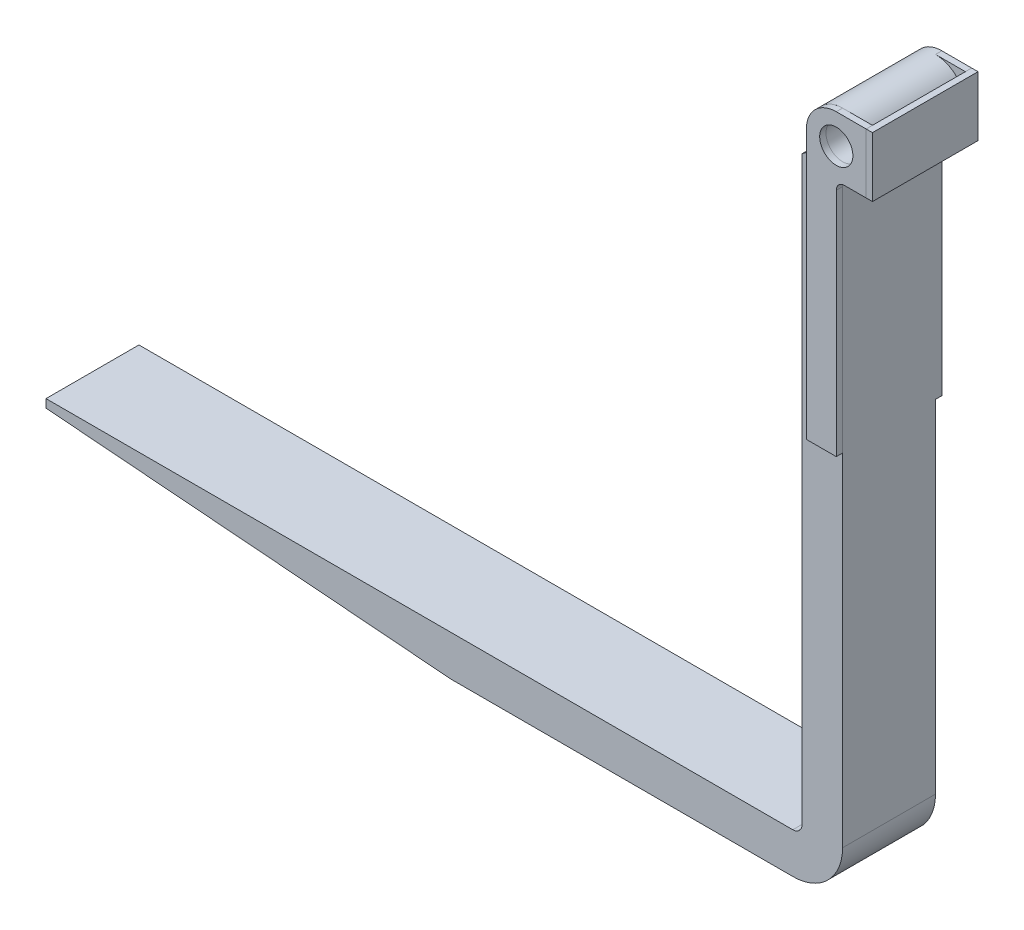
ISO-10303-21;
HEADER;
FILE_DESCRIPTION(('STEP AP214'),'2;1');
FILE_NAME('part.step','',(''),(''),'','','');
FILE_SCHEMA(('AUTOMOTIVE_DESIGN { 1 0 10303 214 1 1 1 1 }'));
ENDSEC;
DATA;
#1=APPLICATION_CONTEXT('core data for automotive mechanical design processes');
#2=APPLICATION_PROTOCOL_DEFINITION('international standard','automotive_design',2000,#1);
#3=PRODUCT_CONTEXT('',#1,'mechanical');
#4=PRODUCT('Part','Part','',(#3));
#5=PRODUCT_RELATED_PRODUCT_CATEGORY('part','',(#4));
#6=PRODUCT_DEFINITION_FORMATION('','',#4);
#7=PRODUCT_DEFINITION_CONTEXT('part definition',#1,'design');
#8=PRODUCT_DEFINITION('design','',#6,#7);
#9=PRODUCT_DEFINITION_SHAPE('','',#8);
#10=(LENGTH_UNIT() NAMED_UNIT(*) SI_UNIT(.MILLI.,.METRE.));
#11=(NAMED_UNIT(*) PLANE_ANGLE_UNIT() SI_UNIT($,.RADIAN.));
#12=(NAMED_UNIT(*) SI_UNIT($,.STERADIAN.) SOLID_ANGLE_UNIT());
#13=UNCERTAINTY_MEASURE_WITH_UNIT(LENGTH_MEASURE(1.E-05),#10,'distance_accuracy_value','');
#14=(GEOMETRIC_REPRESENTATION_CONTEXT(3) GLOBAL_UNCERTAINTY_ASSIGNED_CONTEXT((#13)) GLOBAL_UNIT_ASSIGNED_CONTEXT((#10,
#11,#12)) REPRESENTATION_CONTEXT('',''));
#15=CARTESIAN_POINT('',(0.,0.,0.));
#16=DIRECTION('',(0.,0.,1.));
#17=DIRECTION('',(1.,0.,0.));
#18=AXIS2_PLACEMENT_3D('',#15,#16,#17);
#19=CARTESIAN_POINT('',(54.5,1040.,79.5));
#20=DIRECTION('',(0.,0.,-1.));
#21=DIRECTION('',(-1.,0.,0.));
#22=AXIS2_PLACEMENT_3D('',#19,#20,#21);
#23=PLANE('',#22);
#24=DIRECTION('',(0.,-1.,0.));
#25=VECTOR('',#24,1.);
#26=CARTESIAN_POINT('',(45.,1040.,79.5));
#27=LINE('',#26,#25);
#28=CARTESIAN_POINT('',(45.,1040.,79.5));
#29=VERTEX_POINT('',#28);
#30=CARTESIAN_POINT('',(45.,950.,79.5));
#31=VERTEX_POINT('',#30);
#32=EDGE_CURVE('E114',#29,#31,#27,.T.);
#33=ORIENTED_EDGE('',*,*,#32,.T.);
#34=DIRECTION('',(-1.,0.,0.));
#35=VECTOR('',#34,1.);
#36=CARTESIAN_POINT('',(54.5,950.,79.5));
#37=LINE('',#36,#35);
#38=CARTESIAN_POINT('',(54.5,950.,79.5));
#39=VERTEX_POINT('',#38);
#40=EDGE_CURVE('E12',#39,#31,#37,.T.);
#41=ORIENTED_EDGE('',*,*,#40,.F.);
#42=DIRECTION('',(0.,-1.,0.));
#43=VECTOR('',#42,1.);
#44=CARTESIAN_POINT('',(54.5,1040.,79.5));
#45=LINE('',#44,#43);
#46=CARTESIAN_POINT('',(54.5,1040.,79.5));
#47=VERTEX_POINT('',#46);
#48=EDGE_CURVE('E102',#47,#39,#45,.T.);
#49=ORIENTED_EDGE('',*,*,#48,.F.);
#50=DIRECTION('',(-1.,0.,0.));
#51=VECTOR('',#50,1.);
#52=CARTESIAN_POINT('',(54.5,1040.,79.5));
#53=LINE('',#52,#51);
#54=EDGE_CURVE('E110',#47,#29,#53,.T.);
#55=ORIENTED_EDGE('',*,*,#54,.T.);
#56=EDGE_LOOP('',(#33,#41,#49,#55));
#57=FACE_BOUND('',#56,.T.);
#58=ADVANCED_FACE('F51',(#57),#23,.F.);
#59=CARTESIAN_POINT('',(54.5,950.,79.5));
#60=DIRECTION('',(0.,1.,0.));
#61=DIRECTION('',(-1.,0.,0.));
#62=AXIS2_PLACEMENT_3D('',#59,#60,#61);
#63=PLANE('',#62);
#64=DIRECTION('',(0.,0.,-1.));
#65=VECTOR('',#64,1.);
#66=CARTESIAN_POINT('',(45.,950.,79.5));
#67=LINE('',#66,#65);
#68=CARTESIAN_POINT('',(45.,950.,-79.5));
#69=VERTEX_POINT('',#68);
#70=EDGE_CURVE('E106',#31,#69,#67,.T.);
#71=ORIENTED_EDGE('',*,*,#70,.T.);
#72=DIRECTION('',(-1.,0.,0.));
#73=VECTOR('',#72,1.);
#74=CARTESIAN_POINT('',(54.5,950.,-79.5));
#75=LINE('',#74,#73);
#76=CARTESIAN_POINT('',(54.5,950.,-79.5));
#77=VERTEX_POINT('',#76);
#78=EDGE_CURVE('E59',#77,#69,#75,.T.);
#79=ORIENTED_EDGE('',*,*,#78,.F.);
#80=DIRECTION('',(0.,0.,-1.));
#81=VECTOR('',#80,1.);
#82=CARTESIAN_POINT('',(54.5,950.,79.5));
#83=LINE('',#82,#81);
#84=EDGE_CURVE('E97',#39,#77,#83,.T.);
#85=ORIENTED_EDGE('',*,*,#84,.F.);
#86=ORIENTED_EDGE('',*,*,#40,.T.);
#87=EDGE_LOOP('',(#71,#79,#85,#86));
#88=FACE_BOUND('',#87,.T.);
#89=ADVANCED_FACE('F105',(#88),#63,.F.);
#90=CARTESIAN_POINT('',(54.5,1040.,-79.5));
#91=DIRECTION('',(0.,0.,1.));
#92=DIRECTION('',(1.,0.,0.));
#93=AXIS2_PLACEMENT_3D('',#90,#91,#92);
#94=PLANE('',#93);
#95=DIRECTION('',(0.,1.,0.));
#96=VECTOR('',#95,1.);
#97=CARTESIAN_POINT('',(45.,1040.,-79.5));
#98=LINE('',#97,#96);
#99=CARTESIAN_POINT('',(45.,1040.,-79.5));
#100=VERTEX_POINT('',#99);
#101=EDGE_CURVE('E84',#69,#100,#98,.T.);
#102=ORIENTED_EDGE('',*,*,#101,.T.);
#103=DIRECTION('',(-1.,0.,0.));
#104=VECTOR('',#103,1.);
#105=CARTESIAN_POINT('',(54.5,1040.,-79.5));
#106=LINE('',#105,#104);
#107=CARTESIAN_POINT('',(54.5,1040.,-79.5));
#108=VERTEX_POINT('',#107);
#109=EDGE_CURVE('E107',#108,#100,#106,.T.);
#110=ORIENTED_EDGE('',*,*,#109,.F.);
#111=DIRECTION('',(0.,1.,0.));
#112=VECTOR('',#111,1.);
#113=CARTESIAN_POINT('',(54.5,1040.,-79.5));
#114=LINE('',#113,#112);
#115=EDGE_CURVE('E100',#77,#108,#114,.T.);
#116=ORIENTED_EDGE('',*,*,#115,.F.);
#117=ORIENTED_EDGE('',*,*,#78,.T.);
#118=EDGE_LOOP('',(#102,#110,#116,#117));
#119=FACE_BOUND('',#118,.T.);
#120=ADVANCED_FACE('F108',(#119),#94,.F.);
#121=CARTESIAN_POINT('',(54.5,1040.,79.5));
#122=DIRECTION('',(0.,-1.,0.));
#123=DIRECTION('',(1.,0.,0.));
#124=AXIS2_PLACEMENT_3D('',#121,#122,#123);
#125=PLANE('',#124);
#126=DIRECTION('',(0.,0.,1.));
#127=VECTOR('',#126,1.);
#128=CARTESIAN_POINT('',(45.,1040.,79.5));
#129=LINE('',#128,#127);
#130=EDGE_CURVE('E90',#100,#29,#129,.T.);
#131=ORIENTED_EDGE('',*,*,#130,.T.);
#132=ORIENTED_EDGE('',*,*,#54,.F.);
#133=DIRECTION('',(0.,0.,1.));
#134=VECTOR('',#133,1.);
#135=CARTESIAN_POINT('',(54.5,1040.,79.5));
#136=LINE('',#135,#134);
#137=EDGE_CURVE('E67',#108,#47,#136,.T.);
#138=ORIENTED_EDGE('',*,*,#137,.F.);
#139=ORIENTED_EDGE('',*,*,#109,.T.);
#140=EDGE_LOOP('',(#131,#132,#138,#139));
#141=FACE_BOUND('',#140,.T.);
#142=ADVANCED_FACE('F121',(#141),#125,.F.);
#143=CARTESIAN_POINT('',(54.5000000000002,0.,0.));
#144=DIRECTION('',(1.,0.,0.));
#145=DIRECTION('',(0.,1.,0.));
#146=AXIS2_PLACEMENT_3D('',#143,#144,#145);
#147=PLANE('',#146);
#148=ORIENTED_EDGE('',*,*,#48,.T.);
#149=ORIENTED_EDGE('',*,*,#84,.T.);
#150=ORIENTED_EDGE('',*,*,#115,.T.);
#151=ORIENTED_EDGE('',*,*,#137,.T.);
#152=EDGE_LOOP('',(#148,#149,#150,#151));
#153=FACE_BOUND('',#152,.T.);
#154=ADVANCED_FACE('F98',(#153),#147,.T.);
#155=CARTESIAN_POINT('',(45.0000000000002,0.,0.));
#156=DIRECTION('',(1.,0.,0.));
#157=DIRECTION('',(0.,1.,0.));
#158=AXIS2_PLACEMENT_3D('',#155,#156,#157);
#159=PLANE('',#158);
#160=ORIENTED_EDGE('',*,*,#32,.F.);
#161=ORIENTED_EDGE('',*,*,#130,.F.);
#162=ORIENTED_EDGE('',*,*,#101,.F.);
#163=ORIENTED_EDGE('',*,*,#70,.F.);
#164=EDGE_LOOP('',(#160,#161,#162,#163));
#165=FACE_BOUND('',#164,.T.);
#166=ADVANCED_FACE('F124',(#165),#159,.F.);
#167=CLOSED_SHELL('',(#58,#89,#120,#142,#154,#166));
#168=MANIFOLD_SOLID_BREP('B2',#167);
#169=CARTESIAN_POINT('',(0.,995.,79.5));
#170=DIRECTION('',(0.,0.,-1.));
#171=DIRECTION('',(-1.,0.,0.));
#172=AXIS2_PLACEMENT_3D('',#169,#170,#171);
#173=CYLINDRICAL_SURFACE('',#172,45.);
#174=CARTESIAN_POINT('',(0.,995.,70.));
#175=DIRECTION('',(0.,0.,1.));
#176=DIRECTION('',(1.,0.,0.));
#177=AXIS2_PLACEMENT_3D('',#174,#175,#176);
#178=CIRCLE('',#177,45.);
#179=CARTESIAN_POINT('',(0.,1040.,70.));
#180=VERTEX_POINT('',#179);
#181=CARTESIAN_POINT('',(-45.,995.,70.));
#182=VERTEX_POINT('',#181);
#183=EDGE_CURVE('E285',#180,#182,#178,.T.);
#184=ORIENTED_EDGE('',*,*,#183,.T.);
#185=DIRECTION('',(0.,0.,-1.));
#186=VECTOR('',#185,1.);
#187=CARTESIAN_POINT('',(-45.,995.,79.5));
#188=LINE('',#187,#186);
#189=CARTESIAN_POINT('',(-45.,995.,79.5));
#190=VERTEX_POINT('',#189);
#191=EDGE_CURVE('E49',#190,#182,#188,.T.);
#192=ORIENTED_EDGE('',*,*,#191,.F.);
#193=CARTESIAN_POINT('',(0.,995.,79.5));
#194=DIRECTION('',(0.,0.,1.));
#195=DIRECTION('',(1.,0.,0.));
#196=AXIS2_PLACEMENT_3D('',#193,#194,#195);
#197=CIRCLE('',#196,45.);
#198=CARTESIAN_POINT('',(0.,1040.,79.5));
#199=VERTEX_POINT('',#198);
#200=EDGE_CURVE('E330',#199,#190,#197,.T.);
#201=ORIENTED_EDGE('',*,*,#200,.F.);
#202=DIRECTION('',(0.,0.,-1.));
#203=VECTOR('',#202,1.);
#204=CARTESIAN_POINT('',(0.,1040.,79.5));
#205=LINE('',#204,#203);
#206=EDGE_CURVE('E201',#199,#180,#205,.T.);
#207=ORIENTED_EDGE('',*,*,#206,.T.);
#208=EDGE_LOOP('',(#184,#192,#201,#207));
#209=FACE_BOUND('',#208,.T.);
#210=ADVANCED_FACE('F184',(#209),#173,.T.);
#211=CARTESIAN_POINT('',(-45.000000000002,0.,79.5));
#212=DIRECTION('',(1.,0.,0.));
#213=DIRECTION('',(0.,1.,0.));
#214=AXIS2_PLACEMENT_3D('',#211,#212,#213);
#215=PLANE('',#214);
#216=DIRECTION('',(0.,-1.,0.));
#217=VECTOR('',#216,1.);
#218=CARTESIAN_POINT('',(-45.000000000002,0.,70.));
#219=LINE('',#218,#217);
#220=CARTESIAN_POINT('',(-45.0000000000008,590.,70.));
#221=VERTEX_POINT('',#220);
#222=EDGE_CURVE('E287',#182,#221,#219,.T.);
#223=ORIENTED_EDGE('',*,*,#222,.T.);
#224=DIRECTION('',(0.,0.,-1.));
#225=VECTOR('',#224,1.);
#226=CARTESIAN_POINT('',(-45.0000000000008,590.,79.5));
#227=LINE('',#226,#225);
#228=CARTESIAN_POINT('',(-45.0000000000008,590.,79.5));
#229=VERTEX_POINT('',#228);
#230=EDGE_CURVE('E193',#229,#221,#227,.T.);
#231=ORIENTED_EDGE('',*,*,#230,.F.);
#232=DIRECTION('',(0.,-1.,0.));
#233=VECTOR('',#232,1.);
#234=CARTESIAN_POINT('',(-45.000000000002,0.,79.5));
#235=LINE('',#234,#233);
#236=EDGE_CURVE('E239',#190,#229,#235,.T.);
#237=ORIENTED_EDGE('',*,*,#236,.F.);
#238=ORIENTED_EDGE('',*,*,#191,.T.);
#239=EDGE_LOOP('',(#223,#231,#237,#238));
#240=FACE_BOUND('',#239,.T.);
#241=ADVANCED_FACE('F318',(#240),#215,.F.);
#242=CARTESIAN_POINT('',(-1.45562574339743E-12,590.,79.5));
#243=DIRECTION('',(0.,-1.,0.));
#244=DIRECTION('',(1.,0.,0.));
#245=AXIS2_PLACEMENT_3D('',#242,#243,#244);
#246=PLANE('',#245);
#247=DIRECTION('',(-1.,0.,0.));
#248=VECTOR('',#247,1.);
#249=CARTESIAN_POINT('',(-1.45562574339743E-12,590.,70.));
#250=LINE('',#249,#248);
#251=CARTESIAN_POINT('',(1.67586767851234E-12,590.,70.));
#252=VERTEX_POINT('',#251);
#253=EDGE_CURVE('E290',#252,#221,#250,.T.);
#254=ORIENTED_EDGE('',*,*,#253,.F.);
#255=DIRECTION('',(0.,0.,-1.));
#256=VECTOR('',#255,1.);
#257=CARTESIAN_POINT('',(1.67586767851234E-12,590.,79.5));
#258=LINE('',#257,#256);
#259=CARTESIAN_POINT('',(1.67586767851234E-12,590.,79.5));
#260=VERTEX_POINT('',#259);
#261=EDGE_CURVE('E311',#260,#252,#258,.T.);
#262=ORIENTED_EDGE('',*,*,#261,.F.);
#263=DIRECTION('',(-1.,0.,0.));
#264=VECTOR('',#263,1.);
#265=CARTESIAN_POINT('',(-1.45562574339743E-12,590.,79.5));
#266=LINE('',#265,#264);
#267=EDGE_CURVE('E317',#260,#229,#266,.T.);
#268=ORIENTED_EDGE('',*,*,#267,.T.);
#269=ORIENTED_EDGE('',*,*,#230,.T.);
#270=EDGE_LOOP('',(#254,#262,#268,#269));
#271=FACE_BOUND('',#270,.T.);
#272=ADVANCED_FACE('F315',(#271),#246,.T.);
#273=CARTESIAN_POINT('',(0.,0.,79.5));
#274=DIRECTION('',(1.,0.,0.));
#275=DIRECTION('',(0.,1.,0.));
#276=AXIS2_PLACEMENT_3D('',#273,#274,#275);
#277=PLANE('',#276);
#278=DIRECTION('',(0.,-1.,0.));
#279=VECTOR('',#278,1.);
#280=CARTESIAN_POINT('',(0.,0.,70.));
#281=LINE('',#280,#279);
#282=CARTESIAN_POINT('',(2.66292533661918E-12,937.5,70.));
#283=VERTEX_POINT('',#282);
#284=EDGE_CURVE('E293',#283,#252,#281,.T.);
#285=ORIENTED_EDGE('',*,*,#284,.F.);
#286=DIRECTION('',(0.,0.,-1.));
#287=VECTOR('',#286,1.);
#288=CARTESIAN_POINT('',(2.66292533661918E-12,937.5,79.5));
#289=LINE('',#288,#287);
#290=CARTESIAN_POINT('',(2.66292533661918E-12,937.5,79.5));
#291=VERTEX_POINT('',#290);
#292=EDGE_CURVE('E309',#291,#283,#289,.T.);
#293=ORIENTED_EDGE('',*,*,#292,.F.);
#294=DIRECTION('',(0.,-1.,0.));
#295=VECTOR('',#294,1.);
#296=CARTESIAN_POINT('',(0.,0.,79.5));
#297=LINE('',#296,#295);
#298=EDGE_CURVE('E327',#291,#260,#297,.T.);
#299=ORIENTED_EDGE('',*,*,#298,.T.);
#300=ORIENTED_EDGE('',*,*,#261,.T.);
#301=EDGE_LOOP('',(#285,#293,#299,#300));
#302=FACE_BOUND('',#301,.T.);
#303=ADVANCED_FACE('F325',(#302),#277,.T.);
#304=CARTESIAN_POINT('',(12.5,937.5,79.5));
#305=DIRECTION('',(0.,0.,-1.));
#306=DIRECTION('',(-1.,0.,0.));
#307=AXIS2_PLACEMENT_3D('',#304,#305,#306);
#308=CYLINDRICAL_SURFACE('',#307,12.5);
#309=CARTESIAN_POINT('',(12.5,937.5,70.));
#310=DIRECTION('',(0.,0.,1.));
#311=DIRECTION('',(1.,0.,0.));
#312=AXIS2_PLACEMENT_3D('',#309,#310,#311);
#313=CIRCLE('',#312,12.5);
#314=CARTESIAN_POINT('',(12.5000000000001,950.,70.));
#315=VERTEX_POINT('',#314);
#316=EDGE_CURVE('E296',#315,#283,#313,.T.);
#317=ORIENTED_EDGE('',*,*,#316,.F.);
#318=DIRECTION('',(0.,0.,-1.));
#319=VECTOR('',#318,1.);
#320=CARTESIAN_POINT('',(12.5000000000001,950.,79.5));
#321=LINE('',#320,#319);
#322=CARTESIAN_POINT('',(12.5000000000001,950.,79.5));
#323=VERTEX_POINT('',#322);
#324=EDGE_CURVE('E264',#323,#315,#321,.T.);
#325=ORIENTED_EDGE('',*,*,#324,.F.);
#326=CARTESIAN_POINT('',(12.5,937.5,79.5));
#327=DIRECTION('',(0.,0.,1.));
#328=DIRECTION('',(1.,0.,0.));
#329=AXIS2_PLACEMENT_3D('',#326,#327,#328);
#330=CIRCLE('',#329,12.5);
#331=EDGE_CURVE('E274',#323,#291,#330,.T.);
#332=ORIENTED_EDGE('',*,*,#331,.T.);
#333=ORIENTED_EDGE('',*,*,#292,.T.);
#334=EDGE_LOOP('',(#317,#325,#332,#333));
#335=FACE_BOUND('',#334,.T.);
#336=ADVANCED_FACE('F334',(#335),#308,.F.);
#337=CARTESIAN_POINT('',(0.,950.,79.5));
#338=DIRECTION('',(0.,-1.,0.));
#339=DIRECTION('',(0.,0.,-1.));
#340=AXIS2_PLACEMENT_3D('',#337,#338,#339);
#341=PLANE('',#340);
#342=DIRECTION('',(-1.,0.,0.));
#343=VECTOR('',#342,1.);
#344=CARTESIAN_POINT('',(0.,950.,70.));
#345=LINE('',#344,#343);
#346=CARTESIAN_POINT('',(45.,950.,70.));
#347=VERTEX_POINT('',#346);
#348=EDGE_CURVE('E260',#347,#315,#345,.T.);
#349=ORIENTED_EDGE('',*,*,#348,.F.);
#350=DIRECTION('',(0.,0.,-1.));
#351=VECTOR('',#350,1.);
#352=CARTESIAN_POINT('',(45.,950.,79.5));
#353=LINE('',#352,#351);
#354=CARTESIAN_POINT('',(45.,950.,79.5));
#355=VERTEX_POINT('',#354);
#356=EDGE_CURVE('E255',#355,#347,#353,.T.);
#357=ORIENTED_EDGE('',*,*,#356,.F.);
#358=DIRECTION('',(-1.,0.,0.));
#359=VECTOR('',#358,1.);
#360=CARTESIAN_POINT('',(0.,950.,79.5));
#361=LINE('',#360,#359);
#362=EDGE_CURVE('E258',#355,#323,#361,.T.);
#363=ORIENTED_EDGE('',*,*,#362,.T.);
#364=ORIENTED_EDGE('',*,*,#324,.T.);
#365=EDGE_LOOP('',(#349,#357,#363,#364));
#366=FACE_BOUND('',#365,.T.);
#367=ADVANCED_FACE('F257',(#366),#341,.T.);
#368=CARTESIAN_POINT('',(45.0000000000002,0.,79.5));
#369=DIRECTION('',(1.,0.,0.));
#370=DIRECTION('',(0.,1.,0.));
#371=AXIS2_PLACEMENT_3D('',#368,#369,#370);
#372=PLANE('',#371);
#373=DIRECTION('',(0.,-1.,0.));
#374=VECTOR('',#373,1.);
#375=CARTESIAN_POINT('',(45.0000000000002,0.,70.));
#376=LINE('',#375,#374);
#377=CARTESIAN_POINT('',(45.,1040.,70.));
#378=VERTEX_POINT('',#377);
#379=EDGE_CURVE('E300',#378,#347,#376,.T.);
#380=ORIENTED_EDGE('',*,*,#379,.F.);
#381=DIRECTION('',(0.,0.,-1.));
#382=VECTOR('',#381,1.);
#383=CARTESIAN_POINT('',(45.,1040.,79.5));
#384=LINE('',#383,#382);
#385=CARTESIAN_POINT('',(45.,1040.,79.5));
#386=VERTEX_POINT('',#385);
#387=EDGE_CURVE('E227',#386,#378,#384,.T.);
#388=ORIENTED_EDGE('',*,*,#387,.F.);
#389=DIRECTION('',(0.,-1.,0.));
#390=VECTOR('',#389,1.);
#391=CARTESIAN_POINT('',(45.0000000000002,0.,79.5));
#392=LINE('',#391,#390);
#393=EDGE_CURVE('E271',#386,#355,#392,.T.);
#394=ORIENTED_EDGE('',*,*,#393,.T.);
#395=ORIENTED_EDGE('',*,*,#356,.T.);
#396=EDGE_LOOP('',(#380,#388,#394,#395));
#397=FACE_BOUND('',#396,.T.);
#398=ADVANCED_FACE('F276',(#397),#372,.T.);
#399=CARTESIAN_POINT('',(0.,995.,79.5));
#400=DIRECTION('',(0.,0.,-1.));
#401=DIRECTION('',(-1.,0.,0.));
#402=AXIS2_PLACEMENT_3D('',#399,#400,#401);
#403=CYLINDRICAL_SURFACE('',#402,25.);
#404=CARTESIAN_POINT('',(0.,995.,79.5));
#405=DIRECTION('',(0.,0.,1.));
#406=DIRECTION('',(1.,0.,0.));
#407=AXIS2_PLACEMENT_3D('',#404,#405,#406);
#408=CIRCLE('',#407,25.);
#409=CARTESIAN_POINT('',(25.,995.,79.5));
#410=VERTEX_POINT('',#409);
#411=EDGE_CURVE('E305',#410,#410,#408,.F.);
#412=ORIENTED_EDGE('',*,*,#411,.F.);
#413=EDGE_LOOP('',(#412));
#414=FACE_BOUND('',#413,.T.);
#415=CARTESIAN_POINT('',(0.,995.,70.));
#416=DIRECTION('',(0.,0.,1.));
#417=DIRECTION('',(1.,0.,0.));
#418=AXIS2_PLACEMENT_3D('',#415,#416,#417);
#419=CIRCLE('',#418,25.);
#420=CARTESIAN_POINT('',(25.,995.,70.));
#421=VERTEX_POINT('',#420);
#422=EDGE_CURVE('E282',#421,#421,#419,.F.);
#423=ORIENTED_EDGE('',*,*,#422,.T.);
#424=EDGE_LOOP('',(#423));
#425=FACE_BOUND('',#424,.T.);
#426=ADVANCED_FACE('F186',(#414,#425),#403,.F.);
#427=CARTESIAN_POINT('',(0.,1040.,79.5));
#428=DIRECTION('',(0.,1.,0.));
#429=DIRECTION('',(0.,0.,1.));
#430=AXIS2_PLACEMENT_3D('',#427,#428,#429);
#431=PLANE('',#430);
#432=DIRECTION('',(1.,0.,0.));
#433=VECTOR('',#432,1.);
#434=CARTESIAN_POINT('',(0.,1040.,70.));
#435=LINE('',#434,#433);
#436=EDGE_CURVE('E302',#180,#378,#435,.T.);
#437=ORIENTED_EDGE('',*,*,#436,.F.);
#438=ORIENTED_EDGE('',*,*,#206,.F.);
#439=DIRECTION('',(1.,0.,0.));
#440=VECTOR('',#439,1.);
#441=CARTESIAN_POINT('',(0.,1040.,79.5));
#442=LINE('',#441,#440);
#443=EDGE_CURVE('E277',#199,#386,#442,.T.);
#444=ORIENTED_EDGE('',*,*,#443,.T.);
#445=ORIENTED_EDGE('',*,*,#387,.T.);
#446=EDGE_LOOP('',(#437,#438,#444,#445));
#447=FACE_BOUND('',#446,.T.);
#448=ADVANCED_FACE('F335',(#447),#431,.T.);
#449=CARTESIAN_POINT('',(0.,0.,79.5));
#450=DIRECTION('',(0.,0.,1.));
#451=DIRECTION('',(1.,0.,0.));
#452=AXIS2_PLACEMENT_3D('',#449,#450,#451);
#453=PLANE('',#452);
#454=ORIENTED_EDGE('',*,*,#411,.T.);
#455=EDGE_LOOP('',(#454));
#456=FACE_BOUND('',#455,.T.);
#457=ORIENTED_EDGE('',*,*,#200,.T.);
#458=ORIENTED_EDGE('',*,*,#236,.T.);
#459=ORIENTED_EDGE('',*,*,#267,.F.);
#460=ORIENTED_EDGE('',*,*,#298,.F.);
#461=ORIENTED_EDGE('',*,*,#331,.F.);
#462=ORIENTED_EDGE('',*,*,#362,.F.);
#463=ORIENTED_EDGE('',*,*,#393,.F.);
#464=ORIENTED_EDGE('',*,*,#443,.F.);
#465=EDGE_LOOP('',(#457,#458,#459,#460,#461,#462,#463,#464));
#466=FACE_BOUND('',#465,.T.);
#467=ADVANCED_FACE('F269',(#456,#466),#453,.T.);
#468=CARTESIAN_POINT('',(0.,0.,70.));
#469=DIRECTION('',(0.,0.,1.));
#470=DIRECTION('',(1.,0.,0.));
#471=AXIS2_PLACEMENT_3D('',#468,#469,#470);
#472=PLANE('',#471);
#473=ORIENTED_EDGE('',*,*,#422,.F.);
#474=EDGE_LOOP('',(#473));
#475=FACE_BOUND('',#474,.T.);
#476=ORIENTED_EDGE('',*,*,#183,.F.);
#477=ORIENTED_EDGE('',*,*,#436,.T.);
#478=ORIENTED_EDGE('',*,*,#379,.T.);
#479=ORIENTED_EDGE('',*,*,#348,.T.);
#480=ORIENTED_EDGE('',*,*,#316,.T.);
#481=ORIENTED_EDGE('',*,*,#284,.T.);
#482=ORIENTED_EDGE('',*,*,#253,.T.);
#483=ORIENTED_EDGE('',*,*,#222,.F.);
#484=EDGE_LOOP('',(#476,#477,#478,#479,#480,#481,#482,#483));
#485=FACE_BOUND('',#484,.T.);
#486=ADVANCED_FACE('F321',(#475,#485),#472,.F.);
#487=CLOSED_SHELL('',(#210,#241,#272,#303,#336,#367,#398,#426,#448,#467,#486));
#488=MANIFOLD_SOLID_BREP('B6',#487);
#489=CARTESIAN_POINT('',(0.,0.,-70.));
#490=DIRECTION('',(0.,0.,-1.));
#491=DIRECTION('',(1.,0.,0.));
#492=AXIS2_PLACEMENT_3D('',#489,#490,#491);
#493=PLANE('',#492);
#494=CARTESIAN_POINT('',(0.,995.,-70.));
#495=DIRECTION('',(0.,0.,-1.));
#496=DIRECTION('',(-1.,0.,0.));
#497=AXIS2_PLACEMENT_3D('',#494,#495,#496);
#498=CIRCLE('',#497,45.);
#499=CARTESIAN_POINT('',(0.,950.,-70.));
#500=VERTEX_POINT('',#499);
#501=CARTESIAN_POINT('',(45.,995.,-70.));
#502=VERTEX_POINT('',#501);
#503=EDGE_CURVE('E597',#500,#502,#498,.F.);
#504=ORIENTED_EDGE('',*,*,#503,.F.);
#505=DIRECTION('',(0.,-1.,0.));
#506=VECTOR('',#505,1.);
#507=CARTESIAN_POINT('',(0.,75.0000000000005,-70.));
#508=LINE('',#507,#506);
#509=CARTESIAN_POINT('',(0.,937.5,-70.));
#510=VERTEX_POINT('',#509);
#511=EDGE_CURVE('E711',#500,#510,#508,.T.);
#512=ORIENTED_EDGE('',*,*,#511,.T.);
#513=CARTESIAN_POINT('',(12.5,937.5,-70.));
#514=DIRECTION('',(0.,0.,1.));
#515=DIRECTION('',(1.,0.,0.));
#516=AXIS2_PLACEMENT_3D('',#513,#514,#515);
#517=CIRCLE('',#516,12.5);
#518=CARTESIAN_POINT('',(12.5000000000001,950.,-70.));
#519=VERTEX_POINT('',#518);
#520=EDGE_CURVE('E643',#519,#510,#517,.T.);
#521=ORIENTED_EDGE('',*,*,#520,.F.);
#522=DIRECTION('',(-1.,0.,0.));
#523=VECTOR('',#522,1.);
#524=CARTESIAN_POINT('',(0.,950.,-70.));
#525=LINE('',#524,#523);
#526=CARTESIAN_POINT('',(45.,950.,-70.));
#527=VERTEX_POINT('',#526);
#528=EDGE_CURVE('E651',#527,#519,#525,.T.);
#529=ORIENTED_EDGE('',*,*,#528,.F.);
#530=DIRECTION('',(0.,-1.,0.));
#531=VECTOR('',#530,1.);
#532=CARTESIAN_POINT('',(45.0000000000002,0.,-70.));
#533=LINE('',#532,#531);
#534=EDGE_CURVE('E658',#502,#527,#533,.T.);
#535=ORIENTED_EDGE('',*,*,#534,.F.);
#536=EDGE_LOOP('',(#504,#512,#521,#529,#535));
#537=FACE_BOUND('',#536,.T.);
#538=ADVANCED_FACE('F447',(#537),#493,.F.);
#539=CARTESIAN_POINT('',(0.,995.,-70.));
#540=DIRECTION('',(0.,0.,1.));
#541=DIRECTION('',(1.,0.,0.));
#542=AXIS2_PLACEMENT_3D('',#539,#540,#541);
#543=CIRCLE('',#542,45.);
#544=CARTESIAN_POINT('',(0.,1040.,-70.));
#545=VERTEX_POINT('',#544);
#546=EDGE_CURVE('E606',#502,#545,#543,.T.);
#547=ORIENTED_EDGE('',*,*,#546,.F.);
#548=CARTESIAN_POINT('',(45.,1040.,-70.));
#549=VERTEX_POINT('',#548);
#550=EDGE_CURVE('E659',#549,#502,#533,.T.);
#551=ORIENTED_EDGE('',*,*,#550,.F.);
#552=DIRECTION('',(1.,0.,0.));
#553=VECTOR('',#552,1.);
#554=CARTESIAN_POINT('',(0.,1040.,-70.));
#555=LINE('',#554,#553);
#556=EDGE_CURVE('E670',#545,#549,#555,.T.);
#557=ORIENTED_EDGE('',*,*,#556,.F.);
#558=EDGE_LOOP('',(#547,#551,#557));
#559=FACE_BOUND('',#558,.T.);
#560=ADVANCED_FACE('F767',(#559),#493,.F.);
#561=CARTESIAN_POINT('',(-75.0000000000005,0.,70.));
#562=DIRECTION('',(0.,-1.,0.));
#563=DIRECTION('',(1.,0.,0.));
#564=AXIS2_PLACEMENT_3D('',#561,#562,#563);
#565=PLANE('',#564);
#566=DIRECTION('',(-1.,0.,0.));
#567=VECTOR('',#566,1.);
#568=CARTESIAN_POINT('',(-75.0000000000005,0.,70.));
#569=LINE('',#568,#567);
#570=CARTESIAN_POINT('',(-75.0000000000005,0.,70.));
#571=VERTEX_POINT('',#570);
#572=CARTESIAN_POINT('',(-589.999999999999,0.,70.));
#573=VERTEX_POINT('',#572);
#574=EDGE_CURVE('E689',#571,#573,#569,.T.);
#575=ORIENTED_EDGE('',*,*,#574,.T.);
#576=DIRECTION('',(0.,0.,-1.));
#577=VECTOR('',#576,1.);
#578=CARTESIAN_POINT('',(-590.,0.,2166.14061172003));
#579=LINE('',#578,#577);
#580=CARTESIAN_POINT('',(-590.,0.,-69.9999999999998));
#581=VERTEX_POINT('',#580);
#582=EDGE_CURVE('E675',#573,#581,#579,.T.);
#583=ORIENTED_EDGE('',*,*,#582,.T.);
#584=DIRECTION('',(-1.,0.,0.));
#585=VECTOR('',#584,1.);
#586=CARTESIAN_POINT('',(-75.0000000000005,0.,-70.));
#587=LINE('',#586,#585);
#588=CARTESIAN_POINT('',(-75.0000000000005,0.,-70.));
#589=VERTEX_POINT('',#588);
#590=EDGE_CURVE('E705',#589,#581,#587,.T.);
#591=ORIENTED_EDGE('',*,*,#590,.F.);
#592=DIRECTION('',(0.,0.,-1.));
#593=VECTOR('',#592,1.);
#594=CARTESIAN_POINT('',(-75.0000000000005,0.,70.));
#595=LINE('',#594,#593);
#596=EDGE_CURVE('E727',#571,#589,#595,.T.);
#597=ORIENTED_EDGE('',*,*,#596,.F.);
#598=EDGE_LOOP('',(#575,#583,#591,#597));
#599=FACE_BOUND('',#598,.T.);
#600=ADVANCED_FACE('F774',(#599),#565,.T.);
#601=CARTESIAN_POINT('',(-75.0000000000005,61.,70.));
#602=DIRECTION('',(0.,-1.,0.));
#603=DIRECTION('',(1.,0.,0.));
#604=AXIS2_PLACEMENT_3D('',#601,#602,#603);
#605=PLANE('',#604);
#606=DIRECTION('',(-1.,0.,0.));
#607=VECTOR('',#606,1.);
#608=CARTESIAN_POINT('',(-75.0000000000005,61.,-70.));
#609=LINE('',#608,#607);
#610=CARTESIAN_POINT('',(-75.0000000000005,61.,-70.));
#611=VERTEX_POINT('',#610);
#612=CARTESIAN_POINT('',(-1200.,60.9999999999998,-70.));
#613=VERTEX_POINT('',#612);
#614=EDGE_CURVE('E682',#611,#613,#609,.T.);
#615=ORIENTED_EDGE('',*,*,#614,.T.);
#616=DIRECTION('',(0.,0.,-1.));
#617=VECTOR('',#616,1.);
#618=CARTESIAN_POINT('',(-1200.,60.9999999999998,70.));
#619=LINE('',#618,#617);
#620=CARTESIAN_POINT('',(-1200.,60.9999999999998,70.));
#621=VERTEX_POINT('',#620);
#622=EDGE_CURVE('E728',#621,#613,#619,.T.);
#623=ORIENTED_EDGE('',*,*,#622,.F.);
#624=DIRECTION('',(-1.,0.,0.));
#625=VECTOR('',#624,1.);
#626=CARTESIAN_POINT('',(-75.0000000000005,61.,70.));
#627=LINE('',#626,#625);
#628=CARTESIAN_POINT('',(-75.0000000000005,61.,70.));
#629=VERTEX_POINT('',#628);
#630=EDGE_CURVE('E683',#629,#621,#627,.T.);
#631=ORIENTED_EDGE('',*,*,#630,.F.);
#632=DIRECTION('',(0.,0.,-1.));
#633=VECTOR('',#632,1.);
#634=CARTESIAN_POINT('',(-75.0000000000005,61.,70.));
#635=LINE('',#634,#633);
#636=EDGE_CURVE('E700',#629,#611,#635,.T.);
#637=ORIENTED_EDGE('',*,*,#636,.T.);
#638=EDGE_LOOP('',(#615,#623,#631,#637));
#639=FACE_BOUND('',#638,.T.);
#640=ADVANCED_FACE('F449',(#639),#605,.F.);
#641=CARTESIAN_POINT('',(-1200.,-1.46957615897682E-13,70.));
#642=DIRECTION('',(-1.,0.,0.));
#643=DIRECTION('',(0.,-1.,0.));
#644=AXIS2_PLACEMENT_3D('',#641,#642,#643);
#645=PLANE('',#644);
#646=DIRECTION('',(0.,0.,-1.));
#647=VECTOR('',#646,1.);
#648=CARTESIAN_POINT('',(-1200.,48.5,2166.14061172003));
#649=LINE('',#648,#647);
#650=CARTESIAN_POINT('',(-1200.,48.5,70.));
#651=VERTEX_POINT('',#650);
#652=CARTESIAN_POINT('',(-1200.,48.5,-70.));
#653=VERTEX_POINT('',#652);
#654=EDGE_CURVE('E674',#651,#653,#649,.T.);
#655=ORIENTED_EDGE('',*,*,#654,.F.);
#656=DIRECTION('',(0.,1.,0.));
#657=VECTOR('',#656,1.);
#658=CARTESIAN_POINT('',(-1200.,-1.46957615897682E-13,70.));
#659=LINE('',#658,#657);
#660=EDGE_CURVE('E686',#651,#621,#659,.T.);
#661=ORIENTED_EDGE('',*,*,#660,.T.);
#662=ORIENTED_EDGE('',*,*,#622,.T.);
#663=DIRECTION('',(0.,1.,0.));
#664=VECTOR('',#663,1.);
#665=CARTESIAN_POINT('',(-1200.,-1.46957615897682E-13,-70.));
#666=LINE('',#665,#664);
#667=EDGE_CURVE('E703',#653,#613,#666,.T.);
#668=ORIENTED_EDGE('',*,*,#667,.F.);
#669=EDGE_LOOP('',(#655,#661,#662,#668));
#670=FACE_BOUND('',#669,.T.);
#671=ADVANCED_FACE('F743',(#670),#645,.T.);
#672=CARTESIAN_POINT('',(-75.,75.,70.));
#673=DIRECTION('',(0.,0.,-1.));
#674=DIRECTION('',(-1.,0.,0.));
#675=AXIS2_PLACEMENT_3D('',#672,#673,#674);
#676=CYLINDRICAL_SURFACE('',#675,75.);
#677=CARTESIAN_POINT('',(-75.,75.,-70.));
#678=DIRECTION('',(0.,0.,-1.));
#679=DIRECTION('',(-1.,0.,0.));
#680=AXIS2_PLACEMENT_3D('',#677,#678,#679);
#681=CIRCLE('',#680,75.);
#682=CARTESIAN_POINT('',(0.,75.0000000000005,-70.));
#683=VERTEX_POINT('',#682);
#684=EDGE_CURVE('E707',#683,#589,#681,.T.);
#685=ORIENTED_EDGE('',*,*,#684,.F.);
#686=DIRECTION('',(0.,0.,-1.));
#687=VECTOR('',#686,1.);
#688=CARTESIAN_POINT('',(0.,75.0000000000005,70.));
#689=LINE('',#688,#687);
#690=CARTESIAN_POINT('',(0.,75.0000000000005,70.));
#691=VERTEX_POINT('',#690);
#692=EDGE_CURVE('E724',#691,#683,#689,.T.);
#693=ORIENTED_EDGE('',*,*,#692,.F.);
#694=CARTESIAN_POINT('',(-75.,75.,70.));
#695=DIRECTION('',(0.,0.,-1.));
#696=DIRECTION('',(-1.,0.,0.));
#697=AXIS2_PLACEMENT_3D('',#694,#695,#696);
#698=CIRCLE('',#697,75.);
#699=EDGE_CURVE('E692',#691,#571,#698,.T.);
#700=ORIENTED_EDGE('',*,*,#699,.T.);
#701=ORIENTED_EDGE('',*,*,#596,.T.);
#702=EDGE_LOOP('',(#685,#693,#700,#701));
#703=FACE_BOUND('',#702,.T.);
#704=ADVANCED_FACE('F763',(#703),#676,.T.);
#705=CARTESIAN_POINT('',(0.,75.0000000000005,70.));
#706=DIRECTION('',(1.,0.,0.));
#707=DIRECTION('',(0.,0.,-1.));
#708=AXIS2_PLACEMENT_3D('',#705,#706,#707);
#709=PLANE('',#708);
#710=DIRECTION('',(0.,0.,1.));
#711=VECTOR('',#710,1.);
#712=CARTESIAN_POINT('',(2.66292533661918E-12,937.5,-79.5));
#713=LINE('',#712,#711);
#714=CARTESIAN_POINT('',(2.66292533661918E-12,937.5,-79.5));
#715=VERTEX_POINT('',#714);
#716=EDGE_CURVE('E638',#715,#510,#713,.T.);
#717=ORIENTED_EDGE('',*,*,#716,.T.);
#718=ORIENTED_EDGE('',*,*,#511,.F.);
#719=DIRECTION('',(0.,0.,-1.));
#720=VECTOR('',#719,1.);
#721=CARTESIAN_POINT('',(0.,950.,70.));
#722=LINE('',#721,#720);
#723=CARTESIAN_POINT('',(0.,950.,70.));
#724=VERTEX_POINT('',#723);
#725=EDGE_CURVE('E722',#724,#500,#722,.T.);
#726=ORIENTED_EDGE('',*,*,#725,.F.);
#727=DIRECTION('',(0.,-1.,0.));
#728=VECTOR('',#727,1.);
#729=CARTESIAN_POINT('',(0.,75.0000000000005,70.));
#730=LINE('',#729,#728);
#731=EDGE_CURVE('E605',#724,#691,#730,.T.);
#732=ORIENTED_EDGE('',*,*,#731,.T.);
#733=ORIENTED_EDGE('',*,*,#692,.T.);
#734=CARTESIAN_POINT('',(0.,590.,-70.));
#735=VERTEX_POINT('',#734);
#736=EDGE_CURVE('E710',#735,#683,#508,.T.);
#737=ORIENTED_EDGE('',*,*,#736,.F.);
#738=DIRECTION('',(0.,0.,1.));
#739=VECTOR('',#738,1.);
#740=CARTESIAN_POINT('',(1.67586767851234E-12,590.,-79.5));
#741=LINE('',#740,#739);
#742=CARTESIAN_POINT('',(1.67586767851234E-12,590.,-79.5));
#743=VERTEX_POINT('',#742);
#744=EDGE_CURVE('E633',#743,#735,#741,.T.);
#745=ORIENTED_EDGE('',*,*,#744,.F.);
#746=DIRECTION('',(0.,-1.,0.));
#747=VECTOR('',#746,1.);
#748=CARTESIAN_POINT('',(0.,0.,-79.5));
#749=LINE('',#748,#747);
#750=EDGE_CURVE('E641',#715,#743,#749,.T.);
#751=ORIENTED_EDGE('',*,*,#750,.F.);
#752=EDGE_LOOP('',(#717,#718,#726,#732,#733,#737,#745,#751));
#753=FACE_BOUND('',#752,.T.);
#754=ADVANCED_FACE('F756',(#753),#709,.T.);
#755=CARTESIAN_POINT('',(-61.,75.0000000000005,70.));
#756=DIRECTION('',(1.,0.,0.));
#757=DIRECTION('',(0.,0.,-1.));
#758=AXIS2_PLACEMENT_3D('',#755,#756,#757);
#759=PLANE('',#758);
#760=DIRECTION('',(0.,1.,0.));
#761=VECTOR('',#760,1.);
#762=CARTESIAN_POINT('',(-61.,75.0000000000005,-70.));
#763=LINE('',#762,#761);
#764=CARTESIAN_POINT('',(-61.,950.,-70.));
#765=VERTEX_POINT('',#764);
#766=CARTESIAN_POINT('',(-61.,75.0000000000001,-70.));
#767=VERTEX_POINT('',#766);
#768=EDGE_CURVE('E713',#765,#767,#763,.F.);
#769=ORIENTED_EDGE('',*,*,#768,.T.);
#770=DIRECTION('',(0.,0.,-1.));
#771=VECTOR('',#770,1.);
#772=CARTESIAN_POINT('',(-61.,75.0000000000001,70.));
#773=LINE('',#772,#771);
#774=CARTESIAN_POINT('',(-61.,75.0000000000001,70.));
#775=VERTEX_POINT('',#774);
#776=EDGE_CURVE('E718',#775,#767,#773,.T.);
#777=ORIENTED_EDGE('',*,*,#776,.F.);
#778=DIRECTION('',(0.,1.,0.));
#779=VECTOR('',#778,1.);
#780=CARTESIAN_POINT('',(-61.,75.0000000000005,70.));
#781=LINE('',#780,#779);
#782=CARTESIAN_POINT('',(-61.,950.,70.));
#783=VERTEX_POINT('',#782);
#784=EDGE_CURVE('E696',#783,#775,#781,.F.);
#785=ORIENTED_EDGE('',*,*,#784,.F.);
#786=DIRECTION('',(0.,0.,-1.));
#787=VECTOR('',#786,1.);
#788=CARTESIAN_POINT('',(-61.,950.,70.));
#789=LINE('',#788,#787);
#790=EDGE_CURVE('E585',#783,#765,#789,.T.);
#791=ORIENTED_EDGE('',*,*,#790,.T.);
#792=EDGE_LOOP('',(#769,#777,#785,#791));
#793=FACE_BOUND('',#792,.T.);
#794=ADVANCED_FACE('F754',(#793),#759,.F.);
#795=CARTESIAN_POINT('',(-75.,75.,70.));
#796=DIRECTION('',(0.,0.,-1.));
#797=DIRECTION('',(-1.,0.,0.));
#798=AXIS2_PLACEMENT_3D('',#795,#796,#797);
#799=CYLINDRICAL_SURFACE('',#798,14.);
#800=CARTESIAN_POINT('',(-75.,75.,-70.));
#801=DIRECTION('',(0.,0.,1.));
#802=DIRECTION('',(1.,0.,0.));
#803=AXIS2_PLACEMENT_3D('',#800,#801,#802);
#804=CIRCLE('',#803,14.);
#805=EDGE_CURVE('E687',#767,#611,#804,.F.);
#806=ORIENTED_EDGE('',*,*,#805,.T.);
#807=ORIENTED_EDGE('',*,*,#636,.F.);
#808=CARTESIAN_POINT('',(-75.,75.,70.));
#809=DIRECTION('',(0.,0.,1.));
#810=DIRECTION('',(1.,0.,0.));
#811=AXIS2_PLACEMENT_3D('',#808,#809,#810);
#812=CIRCLE('',#811,14.);
#813=EDGE_CURVE('E698',#775,#629,#812,.F.);
#814=ORIENTED_EDGE('',*,*,#813,.F.);
#815=ORIENTED_EDGE('',*,*,#776,.T.);
#816=EDGE_LOOP('',(#806,#807,#814,#815));
#817=FACE_BOUND('',#816,.T.);
#818=ADVANCED_FACE('F751',(#817),#799,.F.);
#819=CARTESIAN_POINT('',(-75.,75.,70.));
#820=DIRECTION('',(0.,0.,-1.));
#821=DIRECTION('',(-1.,0.,0.));
#822=AXIS2_PLACEMENT_3D('',#819,#820,#821);
#823=PLANE('',#822);
#824=ORIENTED_EDGE('',*,*,#660,.F.);
#825=DIRECTION('',(0.996854130580606,-0.0792580743166547,0.));
#826=VECTOR('',#825,1.);
#827=CARTESIAN_POINT('',(-84.1608042146896,-40.2183622878485,70.));
#828=LINE('',#827,#826);
#829=EDGE_CURVE('E678',#651,#573,#828,.T.);
#830=ORIENTED_EDGE('',*,*,#829,.T.);
#831=ORIENTED_EDGE('',*,*,#574,.F.);
#832=ORIENTED_EDGE('',*,*,#699,.F.);
#833=ORIENTED_EDGE('',*,*,#731,.F.);
#834=CARTESIAN_POINT('',(0.,995.,70.));
#835=DIRECTION('',(0.,0.,1.));
#836=DIRECTION('',(1.,0.,0.));
#837=AXIS2_PLACEMENT_3D('',#834,#835,#836);
#838=CIRCLE('',#837,45.);
#839=CARTESIAN_POINT('',(-36.2125858627836,968.28579731434,70.));
#840=VERTEX_POINT('',#839);
#841=EDGE_CURVE('E595',#724,#840,#838,.T.);
#842=ORIENTED_EDGE('',*,*,#841,.T.);
#843=DIRECTION('',(0.804724130284078,0.593648948570225,0.));
#844=VECTOR('',#843,1.);
#845=CARTESIAN_POINT('',(-475.335015663071,644.343021232159,70.));
#846=LINE('',#845,#844);
#847=EDGE_CURVE('E579',#783,#840,#846,.T.);
#848=ORIENTED_EDGE('',*,*,#847,.F.);
#849=ORIENTED_EDGE('',*,*,#784,.T.);
#850=ORIENTED_EDGE('',*,*,#813,.T.);
#851=ORIENTED_EDGE('',*,*,#630,.T.);
#852=EDGE_LOOP('',(#824,#830,#831,#832,#833,#842,#848,#849,#850,#851));
#853=FACE_BOUND('',#852,.T.);
#854=CARTESIAN_POINT('',(0.,995.,70.));
#855=DIRECTION('',(0.,0.,1.));
#856=DIRECTION('',(1.,0.,0.));
#857=AXIS2_PLACEMENT_3D('',#854,#855,#856);
#858=CIRCLE('',#857,25.);
#859=CARTESIAN_POINT('',(25.,995.,70.));
#860=VERTEX_POINT('',#859);
#861=EDGE_CURVE('E612',#860,#860,#858,.T.);
#862=ORIENTED_EDGE('',*,*,#861,.F.);
#863=EDGE_LOOP('',(#862));
#864=FACE_BOUND('',#863,.T.);
#865=ADVANCED_FACE('F601',(#853,#864),#823,.F.);
#866=CARTESIAN_POINT('',(-75.,75.,-70.));
#867=DIRECTION('',(0.,0.,-1.));
#868=DIRECTION('',(-1.,0.,0.));
#869=AXIS2_PLACEMENT_3D('',#866,#867,#868);
#870=PLANE('',#869);
#871=ORIENTED_EDGE('',*,*,#768,.F.);
#872=DIRECTION('',(0.804724130284078,0.593648948570225,0.));
#873=VECTOR('',#872,1.);
#874=CARTESIAN_POINT('',(-475.335015663071,644.343021232159,-70.));
#875=LINE('',#874,#873);
#876=CARTESIAN_POINT('',(-45.0000000000001,961.803278688524,-70.));
#877=VERTEX_POINT('',#876);
#878=EDGE_CURVE('E588',#765,#877,#875,.T.);
#879=ORIENTED_EDGE('',*,*,#878,.T.);
#880=DIRECTION('',(0.,-1.,0.));
#881=VECTOR('',#880,1.);
#882=CARTESIAN_POINT('',(-45.000000000002,0.,-70.));
#883=LINE('',#882,#881);
#884=CARTESIAN_POINT('',(-45.0000000000008,590.,-70.));
#885=VERTEX_POINT('',#884);
#886=EDGE_CURVE('E182',#877,#885,#883,.T.);
#887=ORIENTED_EDGE('',*,*,#886,.T.);
#888=DIRECTION('',(-1.,0.,0.));
#889=VECTOR('',#888,1.);
#890=CARTESIAN_POINT('',(-1.45562574339743E-12,590.,-70.));
#891=LINE('',#890,#889);
#892=EDGE_CURVE('E630',#735,#885,#891,.T.);
#893=ORIENTED_EDGE('',*,*,#892,.F.);
#894=ORIENTED_EDGE('',*,*,#736,.T.);
#895=ORIENTED_EDGE('',*,*,#684,.T.);
#896=ORIENTED_EDGE('',*,*,#590,.T.);
#897=DIRECTION('',(0.996854130580606,-0.0792580743166547,0.));
#898=VECTOR('',#897,1.);
#899=CARTESIAN_POINT('',(-84.1608042146896,-40.2183622878485,-70.));
#900=LINE('',#899,#898);
#901=EDGE_CURVE('E451',#653,#581,#900,.T.);
#902=ORIENTED_EDGE('',*,*,#901,.F.);
#903=ORIENTED_EDGE('',*,*,#667,.T.);
#904=ORIENTED_EDGE('',*,*,#614,.F.);
#905=ORIENTED_EDGE('',*,*,#805,.F.);
#906=EDGE_LOOP('',(#871,#879,#887,#893,#894,#895,#896,#902,#903,#904,#905));
#907=FACE_BOUND('',#906,.T.);
#908=ADVANCED_FACE('F740',(#907),#870,.T.);
#909=CARTESIAN_POINT('',(-1200.,48.5,2166.14061172003));
#910=DIRECTION('',(0.0792580743166547,0.996854130580606,0.));
#911=DIRECTION('',(-0.996854130580606,0.0792580743166547,0.));
#912=AXIS2_PLACEMENT_3D('',#909,#910,#911);
#913=PLANE('',#912);
#914=ORIENTED_EDGE('',*,*,#829,.F.);
#915=ORIENTED_EDGE('',*,*,#654,.T.);
#916=ORIENTED_EDGE('',*,*,#901,.T.);
#917=ORIENTED_EDGE('',*,*,#582,.F.);
#918=EDGE_LOOP('',(#914,#915,#916,#917));
#919=FACE_BOUND('',#918,.T.);
#920=ADVANCED_FACE('F737',(#919),#913,.F.);
#921=CARTESIAN_POINT('',(-45.,995.,-70.));
#922=VERTEX_POINT('',#921);
#923=EDGE_CURVE('E457',#922,#877,#883,.T.);
#924=ORIENTED_EDGE('',*,*,#923,.T.);
#925=CARTESIAN_POINT('',(-36.2125858627836,968.28579731434,-70.));
#926=VERTEX_POINT('',#925);
#927=EDGE_CURVE('E464',#877,#926,#875,.T.);
#928=ORIENTED_EDGE('',*,*,#927,.T.);
#929=EDGE_CURVE('E596',#922,#926,#543,.T.);
#930=ORIENTED_EDGE('',*,*,#929,.F.);
#931=EDGE_LOOP('',(#924,#928,#930));
#932=FACE_BOUND('',#931,.T.);
#933=ADVANCED_FACE('F770',(#932),#493,.F.);
#934=CARTESIAN_POINT('',(0.,995.,-79.5));
#935=DIRECTION('',(0.,0.,1.));
#936=DIRECTION('',(-1.,0.,0.));
#937=AXIS2_PLACEMENT_3D('',#934,#935,#936);
#938=CYLINDRICAL_SURFACE('',#937,45.);
#939=DIRECTION('',(0.,0.,1.));
#940=VECTOR('',#939,1.);
#941=CARTESIAN_POINT('',(-45.,995.,-79.5));
#942=LINE('',#941,#940);
#943=CARTESIAN_POINT('',(-45.,995.,-79.5));
#944=VERTEX_POINT('',#943);
#945=EDGE_CURVE('E617',#944,#922,#942,.T.);
#946=ORIENTED_EDGE('',*,*,#945,.T.);
#947=ORIENTED_EDGE('',*,*,#929,.T.);
#948=DIRECTION('',(0.,0.,-1.));
#949=VECTOR('',#948,1.);
#950=CARTESIAN_POINT('',(-36.2125858627836,968.28579731434,70.));
#951=LINE('',#950,#949);
#952=EDGE_CURVE('E583',#840,#926,#951,.T.);
#953=ORIENTED_EDGE('',*,*,#952,.F.);
#954=ORIENTED_EDGE('',*,*,#841,.F.);
#955=ORIENTED_EDGE('',*,*,#725,.T.);
#956=ORIENTED_EDGE('',*,*,#503,.T.);
#957=ORIENTED_EDGE('',*,*,#546,.T.);
#958=DIRECTION('',(0.,0.,1.));
#959=VECTOR('',#958,1.);
#960=CARTESIAN_POINT('',(0.,1040.,-79.5));
#961=LINE('',#960,#959);
#962=CARTESIAN_POINT('',(0.,1040.,-79.5));
#963=VERTEX_POINT('',#962);
#964=EDGE_CURVE('E622',#963,#545,#961,.T.);
#965=ORIENTED_EDGE('',*,*,#964,.F.);
#966=CARTESIAN_POINT('',(0.,995.,-79.5));
#967=DIRECTION('',(0.,0.,1.));
#968=DIRECTION('',(1.,0.,0.));
#969=AXIS2_PLACEMENT_3D('',#966,#967,#968);
#970=CIRCLE('',#969,45.);
#971=EDGE_CURVE('E619',#963,#944,#970,.T.);
#972=ORIENTED_EDGE('',*,*,#971,.T.);
#973=EDGE_LOOP('',(#946,#947,#953,#954,#955,#956,#957,#965,#972));
#974=FACE_BOUND('',#973,.T.);
#975=ADVANCED_FACE('F593',(#974),#938,.T.);
#976=CARTESIAN_POINT('',(-45.000000000002,0.,-79.5));
#977=DIRECTION('',(1.,0.,0.));
#978=DIRECTION('',(0.,1.,0.));
#979=AXIS2_PLACEMENT_3D('',#976,#977,#978);
#980=PLANE('',#979);
#981=ORIENTED_EDGE('',*,*,#923,.F.);
#982=ORIENTED_EDGE('',*,*,#945,.F.);
#983=DIRECTION('',(0.,-1.,0.));
#984=VECTOR('',#983,1.);
#985=CARTESIAN_POINT('',(-45.000000000002,0.,-79.5));
#986=LINE('',#985,#984);
#987=CARTESIAN_POINT('',(-45.0000000000008,590.,-79.5));
#988=VERTEX_POINT('',#987);
#989=EDGE_CURVE('E627',#944,#988,#986,.T.);
#990=ORIENTED_EDGE('',*,*,#989,.T.);
#991=DIRECTION('',(0.,0.,1.));
#992=VECTOR('',#991,1.);
#993=CARTESIAN_POINT('',(-45.0000000000008,590.,-79.5));
#994=LINE('',#993,#992);
#995=EDGE_CURVE('E625',#988,#885,#994,.T.);
#996=ORIENTED_EDGE('',*,*,#995,.T.);
#997=ORIENTED_EDGE('',*,*,#886,.F.);
#998=EDGE_LOOP('',(#981,#982,#990,#996,#997));
#999=FACE_BOUND('',#998,.T.);
#1000=ADVANCED_FACE('F783',(#999),#980,.F.);
#1001=CARTESIAN_POINT('',(-1.45562574339743E-12,590.,-79.5));
#1002=DIRECTION('',(0.,-1.,0.));
#1003=DIRECTION('',(1.,0.,0.));
#1004=AXIS2_PLACEMENT_3D('',#1001,#1002,#1003);
#1005=PLANE('',#1004);
#1006=ORIENTED_EDGE('',*,*,#892,.T.);
#1007=ORIENTED_EDGE('',*,*,#995,.F.);
#1008=DIRECTION('',(-1.,0.,0.));
#1009=VECTOR('',#1008,1.);
#1010=CARTESIAN_POINT('',(-1.45562574339743E-12,590.,-79.5));
#1011=LINE('',#1010,#1009);
#1012=EDGE_CURVE('E636',#743,#988,#1011,.T.);
#1013=ORIENTED_EDGE('',*,*,#1012,.F.);
#1014=ORIENTED_EDGE('',*,*,#744,.T.);
#1015=EDGE_LOOP('',(#1006,#1007,#1013,#1014));
#1016=FACE_BOUND('',#1015,.T.);
#1017=ADVANCED_FACE('F789',(#1016),#1005,.T.);
#1018=CARTESIAN_POINT('',(12.5,937.5,-79.5));
#1019=DIRECTION('',(0.,0.,1.));
#1020=DIRECTION('',(-1.,0.,0.));
#1021=AXIS2_PLACEMENT_3D('',#1018,#1019,#1020);
#1022=CYLINDRICAL_SURFACE('',#1021,12.5);
#1023=ORIENTED_EDGE('',*,*,#520,.T.);
#1024=ORIENTED_EDGE('',*,*,#716,.F.);
#1025=CARTESIAN_POINT('',(12.5,937.5,-79.5));
#1026=DIRECTION('',(0.,0.,1.));
#1027=DIRECTION('',(1.,0.,0.));
#1028=AXIS2_PLACEMENT_3D('',#1025,#1026,#1027);
#1029=CIRCLE('',#1028,12.5);
#1030=CARTESIAN_POINT('',(12.5000000000001,950.,-79.5));
#1031=VERTEX_POINT('',#1030);
#1032=EDGE_CURVE('E649',#1031,#715,#1029,.T.);
#1033=ORIENTED_EDGE('',*,*,#1032,.F.);
#1034=DIRECTION('',(0.,0.,1.));
#1035=VECTOR('',#1034,1.);
#1036=CARTESIAN_POINT('',(12.5000000000001,950.,-79.5));
#1037=LINE('',#1036,#1035);
#1038=EDGE_CURVE('E646',#1031,#519,#1037,.T.);
#1039=ORIENTED_EDGE('',*,*,#1038,.T.);
#1040=EDGE_LOOP('',(#1023,#1024,#1033,#1039));
#1041=FACE_BOUND('',#1040,.T.);
#1042=ADVANCED_FACE('F819',(#1041),#1022,.F.);
#1043=CARTESIAN_POINT('',(0.,950.,-79.5));
#1044=DIRECTION('',(0.,-1.,0.));
#1045=DIRECTION('',(0.,0.,1.));
#1046=AXIS2_PLACEMENT_3D('',#1043,#1044,#1045);
#1047=PLANE('',#1046);
#1048=ORIENTED_EDGE('',*,*,#528,.T.);
#1049=ORIENTED_EDGE('',*,*,#1038,.F.);
#1050=DIRECTION('',(-1.,0.,0.));
#1051=VECTOR('',#1050,1.);
#1052=CARTESIAN_POINT('',(0.,950.,-79.5));
#1053=LINE('',#1052,#1051);
#1054=CARTESIAN_POINT('',(45.,950.,-79.5));
#1055=VERTEX_POINT('',#1054);
#1056=EDGE_CURVE('E656',#1055,#1031,#1053,.T.);
#1057=ORIENTED_EDGE('',*,*,#1056,.F.);
#1058=DIRECTION('',(0.,0.,1.));
#1059=VECTOR('',#1058,1.);
#1060=CARTESIAN_POINT('',(45.,950.,-79.5));
#1061=LINE('',#1060,#1059);
#1062=EDGE_CURVE('E653',#1055,#527,#1061,.T.);
#1063=ORIENTED_EDGE('',*,*,#1062,.T.);
#1064=EDGE_LOOP('',(#1048,#1049,#1057,#1063));
#1065=FACE_BOUND('',#1064,.T.);
#1066=ADVANCED_FACE('F817',(#1065),#1047,.T.);
#1067=CARTESIAN_POINT('',(45.0000000000002,0.,-79.5));
#1068=DIRECTION('',(1.,0.,0.));
#1069=DIRECTION('',(0.,1.,0.));
#1070=AXIS2_PLACEMENT_3D('',#1067,#1068,#1069);
#1071=PLANE('',#1070);
#1072=ORIENTED_EDGE('',*,*,#550,.T.);
#1073=ORIENTED_EDGE('',*,*,#534,.T.);
#1074=ORIENTED_EDGE('',*,*,#1062,.F.);
#1075=DIRECTION('',(0.,-1.,0.));
#1076=VECTOR('',#1075,1.);
#1077=CARTESIAN_POINT('',(45.0000000000002,0.,-79.5));
#1078=LINE('',#1077,#1076);
#1079=CARTESIAN_POINT('',(45.,1040.,-79.5));
#1080=VERTEX_POINT('',#1079);
#1081=EDGE_CURVE('E665',#1080,#1055,#1078,.T.);
#1082=ORIENTED_EDGE('',*,*,#1081,.F.);
#1083=DIRECTION('',(0.,0.,1.));
#1084=VECTOR('',#1083,1.);
#1085=CARTESIAN_POINT('',(45.,1040.,-79.5));
#1086=LINE('',#1085,#1084);
#1087=EDGE_CURVE('E662',#1080,#549,#1086,.T.);
#1088=ORIENTED_EDGE('',*,*,#1087,.T.);
#1089=EDGE_LOOP('',(#1072,#1073,#1074,#1082,#1088));
#1090=FACE_BOUND('',#1089,.T.);
#1091=ADVANCED_FACE('F809',(#1090),#1071,.T.);
#1092=CARTESIAN_POINT('',(0.,995.,-79.5));
#1093=DIRECTION('',(0.,0.,1.));
#1094=DIRECTION('',(-1.,0.,0.));
#1095=AXIS2_PLACEMENT_3D('',#1092,#1093,#1094);
#1096=CYLINDRICAL_SURFACE('',#1095,25.);
#1097=CARTESIAN_POINT('',(0.,995.,-79.5));
#1098=DIRECTION('',(0.,0.,1.));
#1099=DIRECTION('',(1.,0.,0.));
#1100=AXIS2_PLACEMENT_3D('',#1097,#1098,#1099);
#1101=CIRCLE('',#1100,25.);
#1102=CARTESIAN_POINT('',(25.,995.,-79.5));
#1103=VERTEX_POINT('',#1102);
#1104=EDGE_CURVE('E667',#1103,#1103,#1101,.F.);
#1105=ORIENTED_EDGE('',*,*,#1104,.T.);
#1106=EDGE_LOOP('',(#1105));
#1107=FACE_BOUND('',#1106,.T.);
#1108=ORIENTED_EDGE('',*,*,#861,.T.);
#1109=EDGE_LOOP('',(#1108));
#1110=FACE_BOUND('',#1109,.T.);
#1111=ADVANCED_FACE('F832',(#1107,#1110),#1096,.F.);
#1112=CARTESIAN_POINT('',(0.,1040.,-79.5));
#1113=DIRECTION('',(0.,1.,0.));
#1114=DIRECTION('',(0.,0.,-1.));
#1115=AXIS2_PLACEMENT_3D('',#1112,#1113,#1114);
#1116=PLANE('',#1115);
#1117=ORIENTED_EDGE('',*,*,#556,.T.);
#1118=ORIENTED_EDGE('',*,*,#1087,.F.);
#1119=DIRECTION('',(1.,0.,0.));
#1120=VECTOR('',#1119,1.);
#1121=CARTESIAN_POINT('',(0.,1040.,-79.5));
#1122=LINE('',#1121,#1120);
#1123=EDGE_CURVE('E672',#963,#1080,#1122,.T.);
#1124=ORIENTED_EDGE('',*,*,#1123,.F.);
#1125=ORIENTED_EDGE('',*,*,#964,.T.);
#1126=EDGE_LOOP('',(#1117,#1118,#1124,#1125));
#1127=FACE_BOUND('',#1126,.T.);
#1128=ADVANCED_FACE('F813',(#1127),#1116,.T.);
#1129=CARTESIAN_POINT('',(0.,0.,-79.5));
#1130=DIRECTION('',(0.,0.,-1.));
#1131=DIRECTION('',(1.,0.,0.));
#1132=AXIS2_PLACEMENT_3D('',#1129,#1130,#1131);
#1133=PLANE('',#1132);
#1134=ORIENTED_EDGE('',*,*,#1104,.F.);
#1135=EDGE_LOOP('',(#1134));
#1136=FACE_BOUND('',#1135,.T.);
#1137=ORIENTED_EDGE('',*,*,#971,.F.);
#1138=ORIENTED_EDGE('',*,*,#1123,.T.);
#1139=ORIENTED_EDGE('',*,*,#1081,.T.);
#1140=ORIENTED_EDGE('',*,*,#1056,.T.);
#1141=ORIENTED_EDGE('',*,*,#1032,.T.);
#1142=ORIENTED_EDGE('',*,*,#750,.T.);
#1143=ORIENTED_EDGE('',*,*,#1012,.T.);
#1144=ORIENTED_EDGE('',*,*,#989,.F.);
#1145=EDGE_LOOP('',(#1137,#1138,#1139,#1140,#1141,#1142,#1143,#1144));
#1146=FACE_BOUND('',#1145,.T.);
#1147=ADVANCED_FACE('F794',(#1136,#1146),#1133,.T.);
#1148=CARTESIAN_POINT('',(-475.335015663071,644.343021232159,70.));
#1149=DIRECTION('',(-0.593648948570226,0.804724130284078,0.));
#1150=DIRECTION('',(-0.804724130284078,-0.593648948570226,0.));
#1151=AXIS2_PLACEMENT_3D('',#1148,#1149,#1150);
#1152=PLANE('',#1151);
#1153=ORIENTED_EDGE('',*,*,#878,.F.);
#1154=ORIENTED_EDGE('',*,*,#790,.F.);
#1155=ORIENTED_EDGE('',*,*,#847,.T.);
#1156=ORIENTED_EDGE('',*,*,#952,.T.);
#1157=ORIENTED_EDGE('',*,*,#927,.F.);
#1158=EDGE_LOOP('',(#1153,#1154,#1155,#1156,#1157));
#1159=FACE_BOUND('',#1158,.T.);
#1160=ADVANCED_FACE('F582',(#1159),#1152,.T.);
#1161=CLOSED_SHELL('',(#538,#560,#600,#640,#671,#704,#754,#794,#818,#865,#908,#920,#933,#975,
#1000,#1017,#1042,#1066,#1091,#1111,#1128,#1147,#1160));
#1162=MANIFOLD_SOLID_BREP('B43',#1161);
#1163=ADVANCED_BREP_SHAPE_REPRESENTATION('',(#18,#168,#488,#1162),#14);
#1164=SHAPE_DEFINITION_REPRESENTATION(#9,#1163);
ENDSEC;
END-ISO-10303-21;
